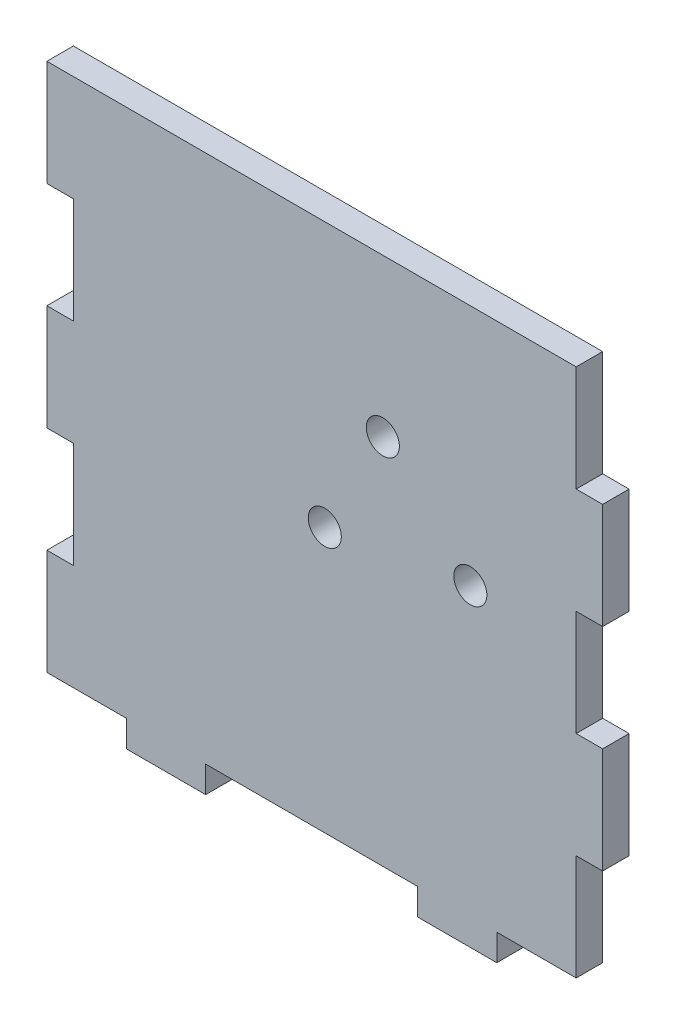
ISO-10303-21;
HEADER;
FILE_DESCRIPTION(('STEP AP214'),'2;1');
FILE_NAME('part.step','',(''),(''),'','','');
FILE_SCHEMA(('AUTOMOTIVE_DESIGN { 1 0 10303 214 1 1 1 1 }'));
ENDSEC;
DATA;
#1=APPLICATION_CONTEXT('core data for automotive mechanical design processes');
#2=APPLICATION_PROTOCOL_DEFINITION('international standard','automotive_design',2000,#1);
#3=PRODUCT_CONTEXT('',#1,'mechanical');
#4=PRODUCT('Part','Part','',(#3));
#5=PRODUCT_RELATED_PRODUCT_CATEGORY('part','',(#4));
#6=PRODUCT_DEFINITION_FORMATION('','',#4);
#7=PRODUCT_DEFINITION_CONTEXT('part definition',#1,'design');
#8=PRODUCT_DEFINITION('design','',#6,#7);
#9=PRODUCT_DEFINITION_SHAPE('','',#8);
#10=(LENGTH_UNIT() NAMED_UNIT(*) SI_UNIT(.MILLI.,.METRE.));
#11=(NAMED_UNIT(*) PLANE_ANGLE_UNIT() SI_UNIT($,.RADIAN.));
#12=(NAMED_UNIT(*) SI_UNIT($,.STERADIAN.) SOLID_ANGLE_UNIT());
#13=UNCERTAINTY_MEASURE_WITH_UNIT(LENGTH_MEASURE(1.E-05),#10,'distance_accuracy_value','');
#14=(GEOMETRIC_REPRESENTATION_CONTEXT(3) GLOBAL_UNCERTAINTY_ASSIGNED_CONTEXT((#13)) GLOBAL_UNIT_ASSIGNED_CONTEXT((#10,
#11,#12)) REPRESENTATION_CONTEXT('',''));
#15=CARTESIAN_POINT('',(0.,0.,0.));
#16=DIRECTION('',(0.,0.,1.));
#17=DIRECTION('',(1.,0.,0.));
#18=AXIS2_PLACEMENT_3D('',#15,#16,#17);
#19=CARTESIAN_POINT('',(-63.5,38.1,6.35));
#20=DIRECTION('',(-1.,0.,0.));
#21=DIRECTION('',(0.,0.,1.));
#22=AXIS2_PLACEMENT_3D('',#19,#20,#21);
#23=PLANE('',#22);
#24=DIRECTION('',(0.,1.,0.));
#25=VECTOR('',#24,1.);
#26=CARTESIAN_POINT('',(-63.5,38.1,0.));
#27=LINE('',#26,#25);
#28=CARTESIAN_POINT('',(-63.5,38.1,0.));
#29=VERTEX_POINT('',#28);
#30=CARTESIAN_POINT('',(-63.5,63.5,0.));
#31=VERTEX_POINT('',#30);
#32=EDGE_CURVE('E252',#29,#31,#27,.T.);
#33=ORIENTED_EDGE('',*,*,#32,.F.);
#34=DIRECTION('',(0.,0.,-1.));
#35=VECTOR('',#34,1.);
#36=CARTESIAN_POINT('',(-63.5,38.1,6.35));
#37=LINE('',#36,#35);
#38=CARTESIAN_POINT('',(-63.5,38.1,6.35));
#39=VERTEX_POINT('',#38);
#40=EDGE_CURVE('E11',#39,#29,#37,.T.);
#41=ORIENTED_EDGE('',*,*,#40,.F.);
#42=DIRECTION('',(0.,1.,0.));
#43=VECTOR('',#42,1.);
#44=CARTESIAN_POINT('',(-63.5,38.1,6.35));
#45=LINE('',#44,#43);
#46=CARTESIAN_POINT('',(-63.5,63.5,6.35));
#47=VERTEX_POINT('',#46);
#48=EDGE_CURVE('E323',#39,#47,#45,.T.);
#49=ORIENTED_EDGE('',*,*,#48,.T.);
#50=DIRECTION('',(0.,0.,-1.));
#51=VECTOR('',#50,1.);
#52=CARTESIAN_POINT('',(-63.5,63.5,6.35));
#53=LINE('',#52,#51);
#54=EDGE_CURVE('E36',#47,#31,#53,.T.);
#55=ORIENTED_EDGE('',*,*,#54,.T.);
#56=EDGE_LOOP('',(#33,#41,#49,#55));
#57=FACE_BOUND('',#56,.T.);
#58=ADVANCED_FACE('F33',(#57),#23,.T.);
#59=CARTESIAN_POINT('',(-63.5,38.1,6.35));
#60=DIRECTION('',(0.,1.,0.));
#61=DIRECTION('',(0.,0.,1.));
#62=AXIS2_PLACEMENT_3D('',#59,#60,#61);
#63=PLANE('',#62);
#64=DIRECTION('',(1.,0.,0.));
#65=VECTOR('',#64,1.);
#66=CARTESIAN_POINT('',(-63.5,38.1,0.));
#67=LINE('',#66,#65);
#68=CARTESIAN_POINT('',(-57.15,38.1,0.));
#69=VERTEX_POINT('',#68);
#70=EDGE_CURVE('E138',#29,#69,#67,.T.);
#71=ORIENTED_EDGE('',*,*,#70,.T.);
#72=DIRECTION('',(0.,0.,-1.));
#73=VECTOR('',#72,1.);
#74=CARTESIAN_POINT('',(-57.15,38.1,6.35));
#75=LINE('',#74,#73);
#76=CARTESIAN_POINT('',(-57.15,38.1,6.35));
#77=VERTEX_POINT('',#76);
#78=EDGE_CURVE('E42',#77,#69,#75,.T.);
#79=ORIENTED_EDGE('',*,*,#78,.F.);
#80=DIRECTION('',(1.,0.,0.));
#81=VECTOR('',#80,1.);
#82=CARTESIAN_POINT('',(-63.5,38.1,6.35));
#83=LINE('',#82,#81);
#84=EDGE_CURVE('E231',#39,#77,#83,.T.);
#85=ORIENTED_EDGE('',*,*,#84,.F.);
#86=ORIENTED_EDGE('',*,*,#40,.T.);
#87=EDGE_LOOP('',(#71,#79,#85,#86));
#88=FACE_BOUND('',#87,.T.);
#89=ADVANCED_FACE('F499',(#88),#63,.F.);
#90=CARTESIAN_POINT('',(-57.15,38.1,6.35));
#91=DIRECTION('',(1.,0.,0.));
#92=DIRECTION('',(0.,1.,0.));
#93=AXIS2_PLACEMENT_3D('',#90,#91,#92);
#94=PLANE('',#93);
#95=DIRECTION('',(0.,-1.,0.));
#96=VECTOR('',#95,1.);
#97=CARTESIAN_POINT('',(-57.15,38.1,0.));
#98=LINE('',#97,#96);
#99=CARTESIAN_POINT('',(-57.15,12.7,0.));
#100=VERTEX_POINT('',#99);
#101=EDGE_CURVE('E238',#69,#100,#98,.T.);
#102=ORIENTED_EDGE('',*,*,#101,.T.);
#103=DIRECTION('',(0.,0.,-1.));
#104=VECTOR('',#103,1.);
#105=CARTESIAN_POINT('',(-57.15,12.7,6.35));
#106=LINE('',#105,#104);
#107=CARTESIAN_POINT('',(-57.15,12.7,6.35));
#108=VERTEX_POINT('',#107);
#109=EDGE_CURVE('E235',#108,#100,#106,.T.);
#110=ORIENTED_EDGE('',*,*,#109,.F.);
#111=DIRECTION('',(0.,-1.,0.));
#112=VECTOR('',#111,1.);
#113=CARTESIAN_POINT('',(-57.15,38.1,6.35));
#114=LINE('',#113,#112);
#115=EDGE_CURVE('E223',#77,#108,#114,.T.);
#116=ORIENTED_EDGE('',*,*,#115,.F.);
#117=ORIENTED_EDGE('',*,*,#78,.T.);
#118=EDGE_LOOP('',(#102,#110,#116,#117));
#119=FACE_BOUND('',#118,.T.);
#120=ADVANCED_FACE('F236',(#119),#94,.F.);
#121=CARTESIAN_POINT('',(-63.5,12.7,6.35));
#122=DIRECTION('',(0.,1.,0.));
#123=DIRECTION('',(-1.,0.,0.));
#124=AXIS2_PLACEMENT_3D('',#121,#122,#123);
#125=PLANE('',#124);
#126=DIRECTION('',(1.,0.,0.));
#127=VECTOR('',#126,1.);
#128=CARTESIAN_POINT('',(-63.5,12.7,0.));
#129=LINE('',#128,#127);
#130=CARTESIAN_POINT('',(-63.5,12.7,0.));
#131=VERTEX_POINT('',#130);
#132=EDGE_CURVE('E320',#131,#100,#129,.T.);
#133=ORIENTED_EDGE('',*,*,#132,.F.);
#134=DIRECTION('',(0.,0.,-1.));
#135=VECTOR('',#134,1.);
#136=CARTESIAN_POINT('',(-63.5,12.7,6.35));
#137=LINE('',#136,#135);
#138=CARTESIAN_POINT('',(-63.5,12.7,6.35));
#139=VERTEX_POINT('',#138);
#140=EDGE_CURVE('E242',#139,#131,#137,.T.);
#141=ORIENTED_EDGE('',*,*,#140,.F.);
#142=DIRECTION('',(1.,0.,0.));
#143=VECTOR('',#142,1.);
#144=CARTESIAN_POINT('',(-63.5,12.7,6.35));
#145=LINE('',#144,#143);
#146=EDGE_CURVE('E229',#139,#108,#145,.T.);
#147=ORIENTED_EDGE('',*,*,#146,.T.);
#148=ORIENTED_EDGE('',*,*,#109,.T.);
#149=EDGE_LOOP('',(#133,#141,#147,#148));
#150=FACE_BOUND('',#149,.T.);
#151=ADVANCED_FACE('F244',(#150),#125,.T.);
#152=CARTESIAN_POINT('',(-63.5,-12.7,6.35));
#153=DIRECTION('',(-1.,0.,0.));
#154=DIRECTION('',(0.,-1.,0.));
#155=AXIS2_PLACEMENT_3D('',#152,#153,#154);
#156=PLANE('',#155);
#157=DIRECTION('',(0.,1.,0.));
#158=VECTOR('',#157,1.);
#159=CARTESIAN_POINT('',(-63.5,-12.7,0.));
#160=LINE('',#159,#158);
#161=CARTESIAN_POINT('',(-63.5,-12.7,0.));
#162=VERTEX_POINT('',#161);
#163=EDGE_CURVE('E317',#162,#131,#160,.T.);
#164=ORIENTED_EDGE('',*,*,#163,.F.);
#165=DIRECTION('',(0.,0.,-1.));
#166=VECTOR('',#165,1.);
#167=CARTESIAN_POINT('',(-63.5,-12.7,6.35));
#168=LINE('',#167,#166);
#169=CARTESIAN_POINT('',(-63.5,-12.7,6.35));
#170=VERTEX_POINT('',#169);
#171=EDGE_CURVE('E327',#170,#162,#168,.T.);
#172=ORIENTED_EDGE('',*,*,#171,.F.);
#173=DIRECTION('',(0.,1.,0.));
#174=VECTOR('',#173,1.);
#175=CARTESIAN_POINT('',(-63.5,-12.7,6.35));
#176=LINE('',#175,#174);
#177=EDGE_CURVE('E245',#170,#139,#176,.T.);
#178=ORIENTED_EDGE('',*,*,#177,.T.);
#179=ORIENTED_EDGE('',*,*,#140,.T.);
#180=EDGE_LOOP('',(#164,#172,#178,#179));
#181=FACE_BOUND('',#180,.T.);
#182=ADVANCED_FACE('F388',(#181),#156,.T.);
#183=CARTESIAN_POINT('',(-63.5,-12.7,6.35));
#184=DIRECTION('',(0.,1.,0.));
#185=DIRECTION('',(0.,0.,1.));
#186=AXIS2_PLACEMENT_3D('',#183,#184,#185);
#187=PLANE('',#186);
#188=DIRECTION('',(1.,0.,0.));
#189=VECTOR('',#188,1.);
#190=CARTESIAN_POINT('',(-63.5,-12.7,0.));
#191=LINE('',#190,#189);
#192=CARTESIAN_POINT('',(-57.15,-12.7,0.));
#193=VERTEX_POINT('',#192);
#194=EDGE_CURVE('E315',#162,#193,#191,.T.);
#195=ORIENTED_EDGE('',*,*,#194,.T.);
#196=DIRECTION('',(0.,0.,-1.));
#197=VECTOR('',#196,1.);
#198=CARTESIAN_POINT('',(-57.15,-12.7,6.35));
#199=LINE('',#198,#197);
#200=CARTESIAN_POINT('',(-57.15,-12.7,6.35));
#201=VERTEX_POINT('',#200);
#202=EDGE_CURVE('E329',#201,#193,#199,.T.);
#203=ORIENTED_EDGE('',*,*,#202,.F.);
#204=DIRECTION('',(1.,0.,0.));
#205=VECTOR('',#204,1.);
#206=CARTESIAN_POINT('',(-63.5,-12.7,6.35));
#207=LINE('',#206,#205);
#208=EDGE_CURVE('E247',#170,#201,#207,.T.);
#209=ORIENTED_EDGE('',*,*,#208,.F.);
#210=ORIENTED_EDGE('',*,*,#171,.T.);
#211=EDGE_LOOP('',(#195,#203,#209,#210));
#212=FACE_BOUND('',#211,.T.);
#213=ADVANCED_FACE('F396',(#212),#187,.F.);
#214=CARTESIAN_POINT('',(-57.15,-12.7,6.35));
#215=DIRECTION('',(1.,0.,0.));
#216=DIRECTION('',(0.,0.,-1.));
#217=AXIS2_PLACEMENT_3D('',#214,#215,#216);
#218=PLANE('',#217);
#219=DIRECTION('',(0.,-1.,0.));
#220=VECTOR('',#219,1.);
#221=CARTESIAN_POINT('',(-57.15,-12.7,0.));
#222=LINE('',#221,#220);
#223=CARTESIAN_POINT('',(-57.15,-38.1,0.));
#224=VERTEX_POINT('',#223);
#225=EDGE_CURVE('E312',#193,#224,#222,.T.);
#226=ORIENTED_EDGE('',*,*,#225,.T.);
#227=DIRECTION('',(0.,0.,-1.));
#228=VECTOR('',#227,1.);
#229=CARTESIAN_POINT('',(-57.15,-38.1,6.35));
#230=LINE('',#229,#228);
#231=CARTESIAN_POINT('',(-57.15,-38.1,6.35));
#232=VERTEX_POINT('',#231);
#233=EDGE_CURVE('E332',#232,#224,#230,.T.);
#234=ORIENTED_EDGE('',*,*,#233,.F.);
#235=DIRECTION('',(0.,-1.,0.));
#236=VECTOR('',#235,1.);
#237=CARTESIAN_POINT('',(-57.15,-12.7,6.35));
#238=LINE('',#237,#236);
#239=EDGE_CURVE('E393',#201,#232,#238,.T.);
#240=ORIENTED_EDGE('',*,*,#239,.F.);
#241=ORIENTED_EDGE('',*,*,#202,.T.);
#242=EDGE_LOOP('',(#226,#234,#240,#241));
#243=FACE_BOUND('',#242,.T.);
#244=ADVANCED_FACE('F398',(#243),#218,.F.);
#245=CARTESIAN_POINT('',(-63.5,-38.1,6.35));
#246=DIRECTION('',(0.,1.,0.));
#247=DIRECTION('',(0.,0.,1.));
#248=AXIS2_PLACEMENT_3D('',#245,#246,#247);
#249=PLANE('',#248);
#250=DIRECTION('',(1.,0.,0.));
#251=VECTOR('',#250,1.);
#252=CARTESIAN_POINT('',(-63.5,-38.1,0.));
#253=LINE('',#252,#251);
#254=CARTESIAN_POINT('',(-63.5,-38.1,0.));
#255=VERTEX_POINT('',#254);
#256=EDGE_CURVE('E309',#255,#224,#253,.T.);
#257=ORIENTED_EDGE('',*,*,#256,.F.);
#258=DIRECTION('',(0.,0.,-1.));
#259=VECTOR('',#258,1.);
#260=CARTESIAN_POINT('',(-63.5,-38.1,6.35));
#261=LINE('',#260,#259);
#262=CARTESIAN_POINT('',(-63.5,-38.1,6.35));
#263=VERTEX_POINT('',#262);
#264=EDGE_CURVE('E334',#263,#255,#261,.T.);
#265=ORIENTED_EDGE('',*,*,#264,.F.);
#266=DIRECTION('',(1.,0.,0.));
#267=VECTOR('',#266,1.);
#268=CARTESIAN_POINT('',(-63.5,-38.1,6.35));
#269=LINE('',#268,#267);
#270=EDGE_CURVE('E400',#263,#232,#269,.T.);
#271=ORIENTED_EDGE('',*,*,#270,.T.);
#272=ORIENTED_EDGE('',*,*,#233,.T.);
#273=EDGE_LOOP('',(#257,#265,#271,#272));
#274=FACE_BOUND('',#273,.T.);
#275=ADVANCED_FACE('F517',(#274),#249,.T.);
#276=CARTESIAN_POINT('',(-63.5,-63.5,6.35));
#277=DIRECTION('',(-1.,0.,0.));
#278=DIRECTION('',(0.,0.,1.));
#279=AXIS2_PLACEMENT_3D('',#276,#277,#278);
#280=PLANE('',#279);
#281=DIRECTION('',(0.,1.,0.));
#282=VECTOR('',#281,1.);
#283=CARTESIAN_POINT('',(-63.5,-63.5,0.));
#284=LINE('',#283,#282);
#285=CARTESIAN_POINT('',(-63.5,-63.5,0.));
#286=VERTEX_POINT('',#285);
#287=EDGE_CURVE('E306',#286,#255,#284,.T.);
#288=ORIENTED_EDGE('',*,*,#287,.F.);
#289=DIRECTION('',(0.,0.,-1.));
#290=VECTOR('',#289,1.);
#291=CARTESIAN_POINT('',(-63.5,-63.5,6.35));
#292=LINE('',#291,#290);
#293=CARTESIAN_POINT('',(-63.5,-63.5,6.35));
#294=VERTEX_POINT('',#293);
#295=EDGE_CURVE('E336',#294,#286,#292,.T.);
#296=ORIENTED_EDGE('',*,*,#295,.F.);
#297=DIRECTION('',(0.,1.,0.));
#298=VECTOR('',#297,1.);
#299=CARTESIAN_POINT('',(-63.5,-63.5,6.35));
#300=LINE('',#299,#298);
#301=EDGE_CURVE('E402',#294,#263,#300,.T.);
#302=ORIENTED_EDGE('',*,*,#301,.T.);
#303=ORIENTED_EDGE('',*,*,#264,.T.);
#304=EDGE_LOOP('',(#288,#296,#302,#303));
#305=FACE_BOUND('',#304,.T.);
#306=ADVANCED_FACE('F520',(#305),#280,.T.);
#307=CARTESIAN_POINT('',(-63.5,-63.5,6.35));
#308=DIRECTION('',(0.,1.,0.));
#309=DIRECTION('',(0.,0.,1.));
#310=AXIS2_PLACEMENT_3D('',#307,#308,#309);
#311=PLANE('',#310);
#312=DIRECTION('',(1.,0.,0.));
#313=VECTOR('',#312,1.);
#314=CARTESIAN_POINT('',(-63.5,-63.5,0.));
#315=LINE('',#314,#313);
#316=CARTESIAN_POINT('',(-44.45,-63.5,0.));
#317=VERTEX_POINT('',#316);
#318=EDGE_CURVE('E304',#286,#317,#315,.T.);
#319=ORIENTED_EDGE('',*,*,#318,.T.);
#320=DIRECTION('',(0.,0.,-1.));
#321=VECTOR('',#320,1.);
#322=CARTESIAN_POINT('',(-44.45,-63.5,6.35));
#323=LINE('',#322,#321);
#324=CARTESIAN_POINT('',(-44.45,-63.5,6.35));
#325=VERTEX_POINT('',#324);
#326=EDGE_CURVE('E338',#325,#317,#323,.T.);
#327=ORIENTED_EDGE('',*,*,#326,.F.);
#328=DIRECTION('',(1.,0.,0.));
#329=VECTOR('',#328,1.);
#330=CARTESIAN_POINT('',(-63.5,-63.5,6.35));
#331=LINE('',#330,#329);
#332=EDGE_CURVE('E407',#294,#325,#331,.T.);
#333=ORIENTED_EDGE('',*,*,#332,.F.);
#334=ORIENTED_EDGE('',*,*,#295,.T.);
#335=EDGE_LOOP('',(#319,#327,#333,#334));
#336=FACE_BOUND('',#335,.T.);
#337=ADVANCED_FACE('F524',(#336),#311,.F.);
#338=CARTESIAN_POINT('',(-44.45,-63.5,6.35));
#339=DIRECTION('',(1.,0.,0.));
#340=DIRECTION('',(0.,0.,-1.));
#341=AXIS2_PLACEMENT_3D('',#338,#339,#340);
#342=PLANE('',#341);
#343=DIRECTION('',(0.,-1.,0.));
#344=VECTOR('',#343,1.);
#345=CARTESIAN_POINT('',(-44.45,-63.5,0.));
#346=LINE('',#345,#344);
#347=CARTESIAN_POINT('',(-44.45,-69.85,0.));
#348=VERTEX_POINT('',#347);
#349=EDGE_CURVE('E302',#317,#348,#346,.T.);
#350=ORIENTED_EDGE('',*,*,#349,.T.);
#351=DIRECTION('',(0.,0.,-1.));
#352=VECTOR('',#351,1.);
#353=CARTESIAN_POINT('',(-44.45,-69.85,6.35));
#354=LINE('',#353,#352);
#355=CARTESIAN_POINT('',(-44.45,-69.85,6.35));
#356=VERTEX_POINT('',#355);
#357=EDGE_CURVE('E341',#356,#348,#354,.T.);
#358=ORIENTED_EDGE('',*,*,#357,.F.);
#359=DIRECTION('',(0.,-1.,0.));
#360=VECTOR('',#359,1.);
#361=CARTESIAN_POINT('',(-44.45,-63.5,6.35));
#362=LINE('',#361,#360);
#363=EDGE_CURVE('E409',#325,#356,#362,.T.);
#364=ORIENTED_EDGE('',*,*,#363,.F.);
#365=ORIENTED_EDGE('',*,*,#326,.T.);
#366=EDGE_LOOP('',(#350,#358,#364,#365));
#367=FACE_BOUND('',#366,.T.);
#368=ADVANCED_FACE('F528',(#367),#342,.F.);
#369=CARTESIAN_POINT('',(-44.45,-69.85,6.35));
#370=DIRECTION('',(0.,1.,0.));
#371=DIRECTION('',(0.,0.,1.));
#372=AXIS2_PLACEMENT_3D('',#369,#370,#371);
#373=PLANE('',#372);
#374=DIRECTION('',(1.,0.,0.));
#375=VECTOR('',#374,1.);
#376=CARTESIAN_POINT('',(-44.45,-69.85,0.));
#377=LINE('',#376,#375);
#378=CARTESIAN_POINT('',(-25.4,-69.85,0.));
#379=VERTEX_POINT('',#378);
#380=EDGE_CURVE('E299',#348,#379,#377,.T.);
#381=ORIENTED_EDGE('',*,*,#380,.T.);
#382=DIRECTION('',(0.,0.,-1.));
#383=VECTOR('',#382,1.);
#384=CARTESIAN_POINT('',(-25.4,-69.85,6.35));
#385=LINE('',#384,#383);
#386=CARTESIAN_POINT('',(-25.4,-69.85,6.35));
#387=VERTEX_POINT('',#386);
#388=EDGE_CURVE('E344',#387,#379,#385,.T.);
#389=ORIENTED_EDGE('',*,*,#388,.F.);
#390=DIRECTION('',(1.,0.,0.));
#391=VECTOR('',#390,1.);
#392=CARTESIAN_POINT('',(-44.45,-69.85,6.35));
#393=LINE('',#392,#391);
#394=EDGE_CURVE('E411',#356,#387,#393,.T.);
#395=ORIENTED_EDGE('',*,*,#394,.F.);
#396=ORIENTED_EDGE('',*,*,#357,.T.);
#397=EDGE_LOOP('',(#381,#389,#395,#396));
#398=FACE_BOUND('',#397,.T.);
#399=ADVANCED_FACE('F532',(#398),#373,.F.);
#400=CARTESIAN_POINT('',(-25.4,-63.5,6.35));
#401=DIRECTION('',(1.,0.,0.));
#402=DIRECTION('',(0.,1.,0.));
#403=AXIS2_PLACEMENT_3D('',#400,#401,#402);
#404=PLANE('',#403);
#405=DIRECTION('',(0.,-1.,0.));
#406=VECTOR('',#405,1.);
#407=CARTESIAN_POINT('',(-25.4,-63.5,0.));
#408=LINE('',#407,#406);
#409=CARTESIAN_POINT('',(-25.4,-63.5,0.));
#410=VERTEX_POINT('',#409);
#411=EDGE_CURVE('E296',#410,#379,#408,.T.);
#412=ORIENTED_EDGE('',*,*,#411,.F.);
#413=DIRECTION('',(0.,0.,-1.));
#414=VECTOR('',#413,1.);
#415=CARTESIAN_POINT('',(-25.4,-63.5,6.35));
#416=LINE('',#415,#414);
#417=CARTESIAN_POINT('',(-25.4,-63.5,6.35));
#418=VERTEX_POINT('',#417);
#419=EDGE_CURVE('E346',#418,#410,#416,.T.);
#420=ORIENTED_EDGE('',*,*,#419,.F.);
#421=DIRECTION('',(0.,-1.,0.));
#422=VECTOR('',#421,1.);
#423=CARTESIAN_POINT('',(-25.4,-63.5,6.35));
#424=LINE('',#423,#422);
#425=EDGE_CURVE('E413',#418,#387,#424,.T.);
#426=ORIENTED_EDGE('',*,*,#425,.T.);
#427=ORIENTED_EDGE('',*,*,#388,.T.);
#428=EDGE_LOOP('',(#412,#420,#426,#427));
#429=FACE_BOUND('',#428,.T.);
#430=ADVANCED_FACE('F536',(#429),#404,.T.);
#431=CARTESIAN_POINT('',(-25.4,-63.5,6.35));
#432=DIRECTION('',(0.,1.,0.));
#433=DIRECTION('',(0.,0.,1.));
#434=AXIS2_PLACEMENT_3D('',#431,#432,#433);
#435=PLANE('',#434);
#436=DIRECTION('',(1.,0.,0.));
#437=VECTOR('',#436,1.);
#438=CARTESIAN_POINT('',(-25.4,-63.5,0.));
#439=LINE('',#438,#437);
#440=CARTESIAN_POINT('',(25.4,-63.5,0.));
#441=VERTEX_POINT('',#440);
#442=EDGE_CURVE('E294',#410,#441,#439,.T.);
#443=ORIENTED_EDGE('',*,*,#442,.T.);
#444=DIRECTION('',(0.,0.,-1.));
#445=VECTOR('',#444,1.);
#446=CARTESIAN_POINT('',(25.4,-63.5,6.35));
#447=LINE('',#446,#445);
#448=CARTESIAN_POINT('',(25.4,-63.5,6.35));
#449=VERTEX_POINT('',#448);
#450=EDGE_CURVE('E348',#449,#441,#447,.T.);
#451=ORIENTED_EDGE('',*,*,#450,.F.);
#452=DIRECTION('',(1.,0.,0.));
#453=VECTOR('',#452,1.);
#454=CARTESIAN_POINT('',(-25.4,-63.5,6.35));
#455=LINE('',#454,#453);
#456=EDGE_CURVE('E416',#418,#449,#455,.T.);
#457=ORIENTED_EDGE('',*,*,#456,.F.);
#458=ORIENTED_EDGE('',*,*,#419,.T.);
#459=EDGE_LOOP('',(#443,#451,#457,#458));
#460=FACE_BOUND('',#459,.T.);
#461=ADVANCED_FACE('F540',(#460),#435,.F.);
#462=CARTESIAN_POINT('',(25.4,-63.5,6.35));
#463=DIRECTION('',(1.,0.,0.));
#464=DIRECTION('',(0.,1.,0.));
#465=AXIS2_PLACEMENT_3D('',#462,#463,#464);
#466=PLANE('',#465);
#467=DIRECTION('',(0.,-1.,0.));
#468=VECTOR('',#467,1.);
#469=CARTESIAN_POINT('',(25.4,-63.5,0.));
#470=LINE('',#469,#468);
#471=CARTESIAN_POINT('',(25.4,-69.85,0.));
#472=VERTEX_POINT('',#471);
#473=EDGE_CURVE('E292',#441,#472,#470,.T.);
#474=ORIENTED_EDGE('',*,*,#473,.T.);
#475=DIRECTION('',(0.,0.,-1.));
#476=VECTOR('',#475,1.);
#477=CARTESIAN_POINT('',(25.4,-69.85,6.35));
#478=LINE('',#477,#476);
#479=CARTESIAN_POINT('',(25.4,-69.85,6.35));
#480=VERTEX_POINT('',#479);
#481=EDGE_CURVE('E351',#480,#472,#478,.T.);
#482=ORIENTED_EDGE('',*,*,#481,.F.);
#483=DIRECTION('',(0.,-1.,0.));
#484=VECTOR('',#483,1.);
#485=CARTESIAN_POINT('',(25.4,-63.5,6.35));
#486=LINE('',#485,#484);
#487=EDGE_CURVE('E418',#449,#480,#486,.T.);
#488=ORIENTED_EDGE('',*,*,#487,.F.);
#489=ORIENTED_EDGE('',*,*,#450,.T.);
#490=EDGE_LOOP('',(#474,#482,#488,#489));
#491=FACE_BOUND('',#490,.T.);
#492=ADVANCED_FACE('F544',(#491),#466,.F.);
#493=CARTESIAN_POINT('',(25.4,-69.85,6.35));
#494=DIRECTION('',(0.,1.,0.));
#495=DIRECTION('',(0.,0.,1.));
#496=AXIS2_PLACEMENT_3D('',#493,#494,#495);
#497=PLANE('',#496);
#498=DIRECTION('',(1.,0.,0.));
#499=VECTOR('',#498,1.);
#500=CARTESIAN_POINT('',(25.4,-69.85,0.));
#501=LINE('',#500,#499);
#502=CARTESIAN_POINT('',(44.45,-69.85,0.));
#503=VERTEX_POINT('',#502);
#504=EDGE_CURVE('E289',#472,#503,#501,.T.);
#505=ORIENTED_EDGE('',*,*,#504,.T.);
#506=DIRECTION('',(0.,0.,-1.));
#507=VECTOR('',#506,1.);
#508=CARTESIAN_POINT('',(44.45,-69.85,6.35));
#509=LINE('',#508,#507);
#510=CARTESIAN_POINT('',(44.45,-69.85,6.35));
#511=VERTEX_POINT('',#510);
#512=EDGE_CURVE('E354',#511,#503,#509,.T.);
#513=ORIENTED_EDGE('',*,*,#512,.F.);
#514=DIRECTION('',(1.,0.,0.));
#515=VECTOR('',#514,1.);
#516=CARTESIAN_POINT('',(25.4,-69.85,6.35));
#517=LINE('',#516,#515);
#518=EDGE_CURVE('E420',#480,#511,#517,.T.);
#519=ORIENTED_EDGE('',*,*,#518,.F.);
#520=ORIENTED_EDGE('',*,*,#481,.T.);
#521=EDGE_LOOP('',(#505,#513,#519,#520));
#522=FACE_BOUND('',#521,.T.);
#523=ADVANCED_FACE('F548',(#522),#497,.F.);
#524=CARTESIAN_POINT('',(44.45,-63.5,6.35));
#525=DIRECTION('',(1.,0.,0.));
#526=DIRECTION('',(0.,0.,-1.));
#527=AXIS2_PLACEMENT_3D('',#524,#525,#526);
#528=PLANE('',#527);
#529=DIRECTION('',(0.,-1.,0.));
#530=VECTOR('',#529,1.);
#531=CARTESIAN_POINT('',(44.45,-63.5,0.));
#532=LINE('',#531,#530);
#533=CARTESIAN_POINT('',(44.45,-63.5,0.));
#534=VERTEX_POINT('',#533);
#535=EDGE_CURVE('E286',#534,#503,#532,.T.);
#536=ORIENTED_EDGE('',*,*,#535,.F.);
#537=DIRECTION('',(0.,0.,-1.));
#538=VECTOR('',#537,1.);
#539=CARTESIAN_POINT('',(44.45,-63.5,6.35));
#540=LINE('',#539,#538);
#541=CARTESIAN_POINT('',(44.45,-63.5,6.35));
#542=VERTEX_POINT('',#541);
#543=EDGE_CURVE('E356',#542,#534,#540,.T.);
#544=ORIENTED_EDGE('',*,*,#543,.F.);
#545=DIRECTION('',(0.,-1.,0.));
#546=VECTOR('',#545,1.);
#547=CARTESIAN_POINT('',(44.45,-63.5,6.35));
#548=LINE('',#547,#546);
#549=EDGE_CURVE('E422',#542,#511,#548,.T.);
#550=ORIENTED_EDGE('',*,*,#549,.T.);
#551=ORIENTED_EDGE('',*,*,#512,.T.);
#552=EDGE_LOOP('',(#536,#544,#550,#551));
#553=FACE_BOUND('',#552,.T.);
#554=ADVANCED_FACE('F552',(#553),#528,.T.);
#555=CARTESIAN_POINT('',(44.45,-63.5,6.35));
#556=DIRECTION('',(0.,1.,0.));
#557=DIRECTION('',(0.,0.,1.));
#558=AXIS2_PLACEMENT_3D('',#555,#556,#557);
#559=PLANE('',#558);
#560=DIRECTION('',(1.,0.,0.));
#561=VECTOR('',#560,1.);
#562=CARTESIAN_POINT('',(44.45,-63.5,0.));
#563=LINE('',#562,#561);
#564=CARTESIAN_POINT('',(63.5,-63.5,0.));
#565=VERTEX_POINT('',#564);
#566=EDGE_CURVE('E284',#534,#565,#563,.T.);
#567=ORIENTED_EDGE('',*,*,#566,.T.);
#568=DIRECTION('',(0.,0.,-1.));
#569=VECTOR('',#568,1.);
#570=CARTESIAN_POINT('',(63.5,-63.5,6.35));
#571=LINE('',#570,#569);
#572=CARTESIAN_POINT('',(63.5,-63.5,6.35));
#573=VERTEX_POINT('',#572);
#574=EDGE_CURVE('E358',#573,#565,#571,.T.);
#575=ORIENTED_EDGE('',*,*,#574,.F.);
#576=DIRECTION('',(1.,0.,0.));
#577=VECTOR('',#576,1.);
#578=CARTESIAN_POINT('',(44.45,-63.5,6.35));
#579=LINE('',#578,#577);
#580=EDGE_CURVE('E425',#542,#573,#579,.T.);
#581=ORIENTED_EDGE('',*,*,#580,.F.);
#582=ORIENTED_EDGE('',*,*,#543,.T.);
#583=EDGE_LOOP('',(#567,#575,#581,#582));
#584=FACE_BOUND('',#583,.T.);
#585=ADVANCED_FACE('F556',(#584),#559,.F.);
#586=CARTESIAN_POINT('',(63.5,-63.5,6.35));
#587=DIRECTION('',(-1.,0.,0.));
#588=DIRECTION('',(0.,0.,1.));
#589=AXIS2_PLACEMENT_3D('',#586,#587,#588);
#590=PLANE('',#589);
#591=DIRECTION('',(0.,1.,0.));
#592=VECTOR('',#591,1.);
#593=CARTESIAN_POINT('',(63.5,-63.5,0.));
#594=LINE('',#593,#592);
#595=CARTESIAN_POINT('',(63.5,-38.1,0.));
#596=VERTEX_POINT('',#595);
#597=EDGE_CURVE('E282',#565,#596,#594,.T.);
#598=ORIENTED_EDGE('',*,*,#597,.T.);
#599=DIRECTION('',(0.,0.,-1.));
#600=VECTOR('',#599,1.);
#601=CARTESIAN_POINT('',(63.5,-38.1,6.35));
#602=LINE('',#601,#600);
#603=CARTESIAN_POINT('',(63.5,-38.1,6.35));
#604=VERTEX_POINT('',#603);
#605=EDGE_CURVE('E361',#604,#596,#602,.T.);
#606=ORIENTED_EDGE('',*,*,#605,.F.);
#607=DIRECTION('',(0.,1.,0.));
#608=VECTOR('',#607,1.);
#609=CARTESIAN_POINT('',(63.5,-63.5,6.35));
#610=LINE('',#609,#608);
#611=EDGE_CURVE('E427',#573,#604,#610,.T.);
#612=ORIENTED_EDGE('',*,*,#611,.F.);
#613=ORIENTED_EDGE('',*,*,#574,.T.);
#614=EDGE_LOOP('',(#598,#606,#612,#613));
#615=FACE_BOUND('',#614,.T.);
#616=ADVANCED_FACE('F560',(#615),#590,.F.);
#617=CARTESIAN_POINT('',(63.5,-38.1,6.35));
#618=DIRECTION('',(0.,1.,0.));
#619=DIRECTION('',(-1.,0.,0.));
#620=AXIS2_PLACEMENT_3D('',#617,#618,#619);
#621=PLANE('',#620);
#622=DIRECTION('',(1.,0.,0.));
#623=VECTOR('',#622,1.);
#624=CARTESIAN_POINT('',(63.5,-38.1,0.));
#625=LINE('',#624,#623);
#626=CARTESIAN_POINT('',(69.8500000000001,-38.1,0.));
#627=VERTEX_POINT('',#626);
#628=EDGE_CURVE('E279',#596,#627,#625,.T.);
#629=ORIENTED_EDGE('',*,*,#628,.T.);
#630=DIRECTION('',(0.,0.,-1.));
#631=VECTOR('',#630,1.);
#632=CARTESIAN_POINT('',(69.8500000000001,-38.1,6.35));
#633=LINE('',#632,#631);
#634=CARTESIAN_POINT('',(69.8500000000001,-38.1,6.35));
#635=VERTEX_POINT('',#634);
#636=EDGE_CURVE('E364',#635,#627,#633,.T.);
#637=ORIENTED_EDGE('',*,*,#636,.F.);
#638=DIRECTION('',(1.,0.,0.));
#639=VECTOR('',#638,1.);
#640=CARTESIAN_POINT('',(63.5,-38.1,6.35));
#641=LINE('',#640,#639);
#642=EDGE_CURVE('E429',#604,#635,#641,.T.);
#643=ORIENTED_EDGE('',*,*,#642,.F.);
#644=ORIENTED_EDGE('',*,*,#605,.T.);
#645=EDGE_LOOP('',(#629,#637,#643,#644));
#646=FACE_BOUND('',#645,.T.);
#647=ADVANCED_FACE('F564',(#646),#621,.F.);
#648=CARTESIAN_POINT('',(69.85,-12.7,6.35));
#649=DIRECTION('',(1.,0.,0.));
#650=DIRECTION('',(0.,1.,0.));
#651=AXIS2_PLACEMENT_3D('',#648,#649,#650);
#652=PLANE('',#651);
#653=DIRECTION('',(0.,-1.,0.));
#654=VECTOR('',#653,1.);
#655=CARTESIAN_POINT('',(69.85,-12.7,0.));
#656=LINE('',#655,#654);
#657=CARTESIAN_POINT('',(69.85,-12.7,0.));
#658=VERTEX_POINT('',#657);
#659=EDGE_CURVE('E276',#658,#627,#656,.T.);
#660=ORIENTED_EDGE('',*,*,#659,.F.);
#661=DIRECTION('',(0.,0.,-1.));
#662=VECTOR('',#661,1.);
#663=CARTESIAN_POINT('',(69.85,-12.7,6.35));
#664=LINE('',#663,#662);
#665=CARTESIAN_POINT('',(69.85,-12.7,6.35));
#666=VERTEX_POINT('',#665);
#667=EDGE_CURVE('E366',#666,#658,#664,.T.);
#668=ORIENTED_EDGE('',*,*,#667,.F.);
#669=DIRECTION('',(0.,-1.,0.));
#670=VECTOR('',#669,1.);
#671=CARTESIAN_POINT('',(69.85,-12.7,6.35));
#672=LINE('',#671,#670);
#673=EDGE_CURVE('E431',#666,#635,#672,.T.);
#674=ORIENTED_EDGE('',*,*,#673,.T.);
#675=ORIENTED_EDGE('',*,*,#636,.T.);
#676=EDGE_LOOP('',(#660,#668,#674,#675));
#677=FACE_BOUND('',#676,.T.);
#678=ADVANCED_FACE('F568',(#677),#652,.T.);
#679=CARTESIAN_POINT('',(63.5,-12.7,6.35));
#680=DIRECTION('',(0.,1.,0.));
#681=DIRECTION('',(0.,0.,1.));
#682=AXIS2_PLACEMENT_3D('',#679,#680,#681);
#683=PLANE('',#682);
#684=DIRECTION('',(1.,0.,0.));
#685=VECTOR('',#684,1.);
#686=CARTESIAN_POINT('',(63.5,-12.7,0.));
#687=LINE('',#686,#685);
#688=CARTESIAN_POINT('',(63.5,-12.7,0.));
#689=VERTEX_POINT('',#688);
#690=EDGE_CURVE('E273',#689,#658,#687,.T.);
#691=ORIENTED_EDGE('',*,*,#690,.F.);
#692=DIRECTION('',(0.,0.,-1.));
#693=VECTOR('',#692,1.);
#694=CARTESIAN_POINT('',(63.5,-12.7,6.35));
#695=LINE('',#694,#693);
#696=CARTESIAN_POINT('',(63.5,-12.7,6.35));
#697=VERTEX_POINT('',#696);
#698=EDGE_CURVE('E368',#697,#689,#695,.T.);
#699=ORIENTED_EDGE('',*,*,#698,.F.);
#700=DIRECTION('',(1.,0.,0.));
#701=VECTOR('',#700,1.);
#702=CARTESIAN_POINT('',(63.5,-12.7,6.35));
#703=LINE('',#702,#701);
#704=EDGE_CURVE('E434',#697,#666,#703,.T.);
#705=ORIENTED_EDGE('',*,*,#704,.T.);
#706=ORIENTED_EDGE('',*,*,#667,.T.);
#707=EDGE_LOOP('',(#691,#699,#705,#706));
#708=FACE_BOUND('',#707,.T.);
#709=ADVANCED_FACE('F572',(#708),#683,.T.);
#710=CARTESIAN_POINT('',(63.5,-12.7,6.35));
#711=DIRECTION('',(-1.,0.,0.));
#712=DIRECTION('',(0.,0.,1.));
#713=AXIS2_PLACEMENT_3D('',#710,#711,#712);
#714=PLANE('',#713);
#715=DIRECTION('',(0.,1.,0.));
#716=VECTOR('',#715,1.);
#717=CARTESIAN_POINT('',(63.5,-12.7,0.));
#718=LINE('',#717,#716);
#719=CARTESIAN_POINT('',(63.5,12.7,0.));
#720=VERTEX_POINT('',#719);
#721=EDGE_CURVE('E271',#689,#720,#718,.T.);
#722=ORIENTED_EDGE('',*,*,#721,.T.);
#723=DIRECTION('',(0.,0.,-1.));
#724=VECTOR('',#723,1.);
#725=CARTESIAN_POINT('',(63.5,12.7,6.35));
#726=LINE('',#725,#724);
#727=CARTESIAN_POINT('',(63.5,12.7,6.35));
#728=VERTEX_POINT('',#727);
#729=EDGE_CURVE('E370',#728,#720,#726,.T.);
#730=ORIENTED_EDGE('',*,*,#729,.F.);
#731=DIRECTION('',(0.,1.,0.));
#732=VECTOR('',#731,1.);
#733=CARTESIAN_POINT('',(63.5,-12.7,6.35));
#734=LINE('',#733,#732);
#735=EDGE_CURVE('E437',#697,#728,#734,.T.);
#736=ORIENTED_EDGE('',*,*,#735,.F.);
#737=ORIENTED_EDGE('',*,*,#698,.T.);
#738=EDGE_LOOP('',(#722,#730,#736,#737));
#739=FACE_BOUND('',#738,.T.);
#740=ADVANCED_FACE('F576',(#739),#714,.F.);
#741=CARTESIAN_POINT('',(63.5,12.7,6.35));
#742=DIRECTION('',(0.,1.,0.));
#743=DIRECTION('',(0.,0.,1.));
#744=AXIS2_PLACEMENT_3D('',#741,#742,#743);
#745=PLANE('',#744);
#746=DIRECTION('',(1.,0.,0.));
#747=VECTOR('',#746,1.);
#748=CARTESIAN_POINT('',(63.5,12.7,0.));
#749=LINE('',#748,#747);
#750=CARTESIAN_POINT('',(69.85,12.7,0.));
#751=VERTEX_POINT('',#750);
#752=EDGE_CURVE('E268',#720,#751,#749,.T.);
#753=ORIENTED_EDGE('',*,*,#752,.T.);
#754=DIRECTION('',(0.,0.,-1.));
#755=VECTOR('',#754,1.);
#756=CARTESIAN_POINT('',(69.85,12.7,6.35));
#757=LINE('',#756,#755);
#758=CARTESIAN_POINT('',(69.85,12.7,6.35));
#759=VERTEX_POINT('',#758);
#760=EDGE_CURVE('E373',#759,#751,#757,.T.);
#761=ORIENTED_EDGE('',*,*,#760,.F.);
#762=DIRECTION('',(1.,0.,0.));
#763=VECTOR('',#762,1.);
#764=CARTESIAN_POINT('',(63.5,12.7,6.35));
#765=LINE('',#764,#763);
#766=EDGE_CURVE('E439',#728,#759,#765,.T.);
#767=ORIENTED_EDGE('',*,*,#766,.F.);
#768=ORIENTED_EDGE('',*,*,#729,.T.);
#769=EDGE_LOOP('',(#753,#761,#767,#768));
#770=FACE_BOUND('',#769,.T.);
#771=ADVANCED_FACE('F580',(#770),#745,.F.);
#772=CARTESIAN_POINT('',(69.85,38.1,6.35));
#773=DIRECTION('',(1.,0.,0.));
#774=DIRECTION('',(0.,0.,-1.));
#775=AXIS2_PLACEMENT_3D('',#772,#773,#774);
#776=PLANE('',#775);
#777=DIRECTION('',(0.,-1.,0.));
#778=VECTOR('',#777,1.);
#779=CARTESIAN_POINT('',(69.85,38.1,0.));
#780=LINE('',#779,#778);
#781=CARTESIAN_POINT('',(69.85,38.1,0.));
#782=VERTEX_POINT('',#781);
#783=EDGE_CURVE('E265',#782,#751,#780,.T.);
#784=ORIENTED_EDGE('',*,*,#783,.F.);
#785=DIRECTION('',(0.,0.,-1.));
#786=VECTOR('',#785,1.);
#787=CARTESIAN_POINT('',(69.85,38.1,6.35));
#788=LINE('',#787,#786);
#789=CARTESIAN_POINT('',(69.85,38.1,6.35));
#790=VERTEX_POINT('',#789);
#791=EDGE_CURVE('E375',#790,#782,#788,.T.);
#792=ORIENTED_EDGE('',*,*,#791,.F.);
#793=DIRECTION('',(0.,-1.,0.));
#794=VECTOR('',#793,1.);
#795=CARTESIAN_POINT('',(69.85,38.1,6.35));
#796=LINE('',#795,#794);
#797=EDGE_CURVE('E441',#790,#759,#796,.T.);
#798=ORIENTED_EDGE('',*,*,#797,.T.);
#799=ORIENTED_EDGE('',*,*,#760,.T.);
#800=EDGE_LOOP('',(#784,#792,#798,#799));
#801=FACE_BOUND('',#800,.T.);
#802=ADVANCED_FACE('F584',(#801),#776,.T.);
#803=CARTESIAN_POINT('',(63.5,38.1,6.35));
#804=DIRECTION('',(0.,1.,0.));
#805=DIRECTION('',(-1.,0.,0.));
#806=AXIS2_PLACEMENT_3D('',#803,#804,#805);
#807=PLANE('',#806);
#808=DIRECTION('',(1.,0.,0.));
#809=VECTOR('',#808,1.);
#810=CARTESIAN_POINT('',(63.5,38.1,0.));
#811=LINE('',#810,#809);
#812=CARTESIAN_POINT('',(63.5,38.1,0.));
#813=VERTEX_POINT('',#812);
#814=EDGE_CURVE('E262',#813,#782,#811,.T.);
#815=ORIENTED_EDGE('',*,*,#814,.F.);
#816=DIRECTION('',(0.,0.,-1.));
#817=VECTOR('',#816,1.);
#818=CARTESIAN_POINT('',(63.5,38.1,6.35));
#819=LINE('',#818,#817);
#820=CARTESIAN_POINT('',(63.5,38.1,6.35));
#821=VERTEX_POINT('',#820);
#822=EDGE_CURVE('E377',#821,#813,#819,.T.);
#823=ORIENTED_EDGE('',*,*,#822,.F.);
#824=DIRECTION('',(1.,0.,0.));
#825=VECTOR('',#824,1.);
#826=CARTESIAN_POINT('',(63.5,38.1,6.35));
#827=LINE('',#826,#825);
#828=EDGE_CURVE('E444',#821,#790,#827,.T.);
#829=ORIENTED_EDGE('',*,*,#828,.T.);
#830=ORIENTED_EDGE('',*,*,#791,.T.);
#831=EDGE_LOOP('',(#815,#823,#829,#830));
#832=FACE_BOUND('',#831,.T.);
#833=ADVANCED_FACE('F588',(#832),#807,.T.);
#834=CARTESIAN_POINT('',(63.5,38.1,6.35));
#835=DIRECTION('',(-1.,0.,0.));
#836=DIRECTION('',(0.,0.,1.));
#837=AXIS2_PLACEMENT_3D('',#834,#835,#836);
#838=PLANE('',#837);
#839=DIRECTION('',(0.,1.,0.));
#840=VECTOR('',#839,1.);
#841=CARTESIAN_POINT('',(63.5,38.1,0.));
#842=LINE('',#841,#840);
#843=CARTESIAN_POINT('',(63.5,63.5,0.));
#844=VERTEX_POINT('',#843);
#845=EDGE_CURVE('E259',#813,#844,#842,.T.);
#846=ORIENTED_EDGE('',*,*,#845,.T.);
#847=DIRECTION('',(0.,0.,-1.));
#848=VECTOR('',#847,1.);
#849=CARTESIAN_POINT('',(63.5,63.5,6.35));
#850=LINE('',#849,#848);
#851=CARTESIAN_POINT('',(63.5,63.5,6.35));
#852=VERTEX_POINT('',#851);
#853=EDGE_CURVE('E378',#852,#844,#850,.T.);
#854=ORIENTED_EDGE('',*,*,#853,.F.);
#855=DIRECTION('',(0.,1.,0.));
#856=VECTOR('',#855,1.);
#857=CARTESIAN_POINT('',(63.5,38.1,6.35));
#858=LINE('',#857,#856);
#859=EDGE_CURVE('E447',#821,#852,#858,.T.);
#860=ORIENTED_EDGE('',*,*,#859,.F.);
#861=ORIENTED_EDGE('',*,*,#822,.T.);
#862=EDGE_LOOP('',(#846,#854,#860,#861));
#863=FACE_BOUND('',#862,.T.);
#864=ADVANCED_FACE('F592',(#863),#838,.F.);
#865=CARTESIAN_POINT('',(-63.5,63.5,6.35));
#866=DIRECTION('',(0.,1.,0.));
#867=DIRECTION('',(0.,0.,1.));
#868=AXIS2_PLACEMENT_3D('',#865,#866,#867);
#869=PLANE('',#868);
#870=DIRECTION('',(1.,0.,0.));
#871=VECTOR('',#870,1.);
#872=CARTESIAN_POINT('',(-63.5,63.5,0.));
#873=LINE('',#872,#871);
#874=EDGE_CURVE('E255',#31,#844,#873,.T.);
#875=ORIENTED_EDGE('',*,*,#874,.F.);
#876=ORIENTED_EDGE('',*,*,#54,.F.);
#877=DIRECTION('',(1.,0.,0.));
#878=VECTOR('',#877,1.);
#879=CARTESIAN_POINT('',(-63.5,63.5,6.35));
#880=LINE('',#879,#878);
#881=EDGE_CURVE('E449',#47,#852,#880,.T.);
#882=ORIENTED_EDGE('',*,*,#881,.T.);
#883=ORIENTED_EDGE('',*,*,#853,.T.);
#884=EDGE_LOOP('',(#875,#876,#882,#883));
#885=FACE_BOUND('',#884,.T.);
#886=ADVANCED_FACE('F380',(#885),#869,.T.);
#887=CARTESIAN_POINT('',(0.,0.,6.35));
#888=DIRECTION('',(0.,0.,-1.));
#889=DIRECTION('',(-1.,0.,0.));
#890=AXIS2_PLACEMENT_3D('',#887,#888,#889);
#891=PLANE('',#890);
#892=CARTESIAN_POINT('',(17.1052508833751,25.7754466796645,6.35));
#893=DIRECTION('',(0.,0.,1.));
#894=DIRECTION('',(1.,0.,0.));
#895=AXIS2_PLACEMENT_3D('',#892,#893,#894);
#896=CIRCLE('',#895,3.96875000000001);
#897=CARTESIAN_POINT('',(21.0740008833751,25.7754466796645,6.35));
#898=VERTEX_POINT('',#897);
#899=EDGE_CURVE('E464',#898,#898,#896,.T.);
#900=ORIENTED_EDGE('',*,*,#899,.F.);
#901=EDGE_LOOP('',(#900));
#902=FACE_BOUND('',#901,.T.);
#903=CARTESIAN_POINT('',(38.1,5.33905632471252,6.35));
#904=DIRECTION('',(0.,0.,1.));
#905=DIRECTION('',(1.,0.,0.));
#906=AXIS2_PLACEMENT_3D('',#903,#904,#905);
#907=CIRCLE('',#906,3.96874999999999);
#908=CARTESIAN_POINT('',(42.06875,5.33905632471252,6.35));
#909=VERTEX_POINT('',#908);
#910=EDGE_CURVE('E458',#909,#909,#907,.T.);
#911=ORIENTED_EDGE('',*,*,#910,.F.);
#912=EDGE_LOOP('',(#911));
#913=FACE_BOUND('',#912,.T.);
#914=CARTESIAN_POINT('',(3.17500000000001,0.,6.35));
#915=DIRECTION('',(0.,0.,1.));
#916=DIRECTION('',(1.,0.,0.));
#917=AXIS2_PLACEMENT_3D('',#914,#915,#916);
#918=CIRCLE('',#917,3.96875);
#919=CARTESIAN_POINT('',(7.14375000000001,0.,6.35));
#920=VERTEX_POINT('',#919);
#921=EDGE_CURVE('E452',#920,#920,#918,.T.);
#922=ORIENTED_EDGE('',*,*,#921,.F.);
#923=EDGE_LOOP('',(#922));
#924=FACE_BOUND('',#923,.T.);
#925=ORIENTED_EDGE('',*,*,#48,.F.);
#926=ORIENTED_EDGE('',*,*,#84,.T.);
#927=ORIENTED_EDGE('',*,*,#115,.T.);
#928=ORIENTED_EDGE('',*,*,#146,.F.);
#929=ORIENTED_EDGE('',*,*,#177,.F.);
#930=ORIENTED_EDGE('',*,*,#208,.T.);
#931=ORIENTED_EDGE('',*,*,#239,.T.);
#932=ORIENTED_EDGE('',*,*,#270,.F.);
#933=ORIENTED_EDGE('',*,*,#301,.F.);
#934=ORIENTED_EDGE('',*,*,#332,.T.);
#935=ORIENTED_EDGE('',*,*,#363,.T.);
#936=ORIENTED_EDGE('',*,*,#394,.T.);
#937=ORIENTED_EDGE('',*,*,#425,.F.);
#938=ORIENTED_EDGE('',*,*,#456,.T.);
#939=ORIENTED_EDGE('',*,*,#487,.T.);
#940=ORIENTED_EDGE('',*,*,#518,.T.);
#941=ORIENTED_EDGE('',*,*,#549,.F.);
#942=ORIENTED_EDGE('',*,*,#580,.T.);
#943=ORIENTED_EDGE('',*,*,#611,.T.);
#944=ORIENTED_EDGE('',*,*,#642,.T.);
#945=ORIENTED_EDGE('',*,*,#673,.F.);
#946=ORIENTED_EDGE('',*,*,#704,.F.);
#947=ORIENTED_EDGE('',*,*,#735,.T.);
#948=ORIENTED_EDGE('',*,*,#766,.T.);
#949=ORIENTED_EDGE('',*,*,#797,.F.);
#950=ORIENTED_EDGE('',*,*,#828,.F.);
#951=ORIENTED_EDGE('',*,*,#859,.T.);
#952=ORIENTED_EDGE('',*,*,#881,.F.);
#953=EDGE_LOOP('',(#925,#926,#927,#928,#929,#930,#931,#932,#933,#934,#935,#936,#937,#938,#939,
#940,#941,#942,#943,#944,#945,#946,#947,#948,#949,#950,#951,#952));
#954=FACE_BOUND('',#953,.T.);
#955=ADVANCED_FACE('F226',(#902,#913,#924,#954),#891,.F.);
#956=CARTESIAN_POINT('',(0.,0.,0.));
#957=DIRECTION('',(0.,0.,-1.));
#958=DIRECTION('',(-1.,0.,0.));
#959=AXIS2_PLACEMENT_3D('',#956,#957,#958);
#960=PLANE('',#959);
#961=CARTESIAN_POINT('',(17.1052508833751,25.7754466796645,0.));
#962=DIRECTION('',(0.,0.,1.));
#963=DIRECTION('',(1.,0.,0.));
#964=AXIS2_PLACEMENT_3D('',#961,#962,#963);
#965=CIRCLE('',#964,3.96875000000001);
#966=CARTESIAN_POINT('',(21.0740008833751,25.7754466796645,0.));
#967=VERTEX_POINT('',#966);
#968=EDGE_CURVE('E461',#967,#967,#965,.T.);
#969=ORIENTED_EDGE('',*,*,#968,.T.);
#970=EDGE_LOOP('',(#969));
#971=FACE_BOUND('',#970,.T.);
#972=CARTESIAN_POINT('',(38.1,5.33905632471252,0.));
#973=DIRECTION('',(0.,0.,1.));
#974=DIRECTION('',(1.,0.,0.));
#975=AXIS2_PLACEMENT_3D('',#972,#973,#974);
#976=CIRCLE('',#975,3.96874999999999);
#977=CARTESIAN_POINT('',(42.06875,5.33905632471252,0.));
#978=VERTEX_POINT('',#977);
#979=EDGE_CURVE('E455',#978,#978,#976,.T.);
#980=ORIENTED_EDGE('',*,*,#979,.T.);
#981=EDGE_LOOP('',(#980));
#982=FACE_BOUND('',#981,.T.);
#983=CARTESIAN_POINT('',(3.17500000000001,0.,0.));
#984=DIRECTION('',(0.,0.,1.));
#985=DIRECTION('',(1.,0.,0.));
#986=AXIS2_PLACEMENT_3D('',#983,#984,#985);
#987=CIRCLE('',#986,3.96875);
#988=CARTESIAN_POINT('',(7.14375000000001,0.,0.));
#989=VERTEX_POINT('',#988);
#990=EDGE_CURVE('E256',#989,#989,#987,.T.);
#991=ORIENTED_EDGE('',*,*,#990,.T.);
#992=EDGE_LOOP('',(#991));
#993=FACE_BOUND('',#992,.T.);
#994=ORIENTED_EDGE('',*,*,#32,.T.);
#995=ORIENTED_EDGE('',*,*,#874,.T.);
#996=ORIENTED_EDGE('',*,*,#845,.F.);
#997=ORIENTED_EDGE('',*,*,#814,.T.);
#998=ORIENTED_EDGE('',*,*,#783,.T.);
#999=ORIENTED_EDGE('',*,*,#752,.F.);
#1000=ORIENTED_EDGE('',*,*,#721,.F.);
#1001=ORIENTED_EDGE('',*,*,#690,.T.);
#1002=ORIENTED_EDGE('',*,*,#659,.T.);
#1003=ORIENTED_EDGE('',*,*,#628,.F.);
#1004=ORIENTED_EDGE('',*,*,#597,.F.);
#1005=ORIENTED_EDGE('',*,*,#566,.F.);
#1006=ORIENTED_EDGE('',*,*,#535,.T.);
#1007=ORIENTED_EDGE('',*,*,#504,.F.);
#1008=ORIENTED_EDGE('',*,*,#473,.F.);
#1009=ORIENTED_EDGE('',*,*,#442,.F.);
#1010=ORIENTED_EDGE('',*,*,#411,.T.);
#1011=ORIENTED_EDGE('',*,*,#380,.F.);
#1012=ORIENTED_EDGE('',*,*,#349,.F.);
#1013=ORIENTED_EDGE('',*,*,#318,.F.);
#1014=ORIENTED_EDGE('',*,*,#287,.T.);
#1015=ORIENTED_EDGE('',*,*,#256,.T.);
#1016=ORIENTED_EDGE('',*,*,#225,.F.);
#1017=ORIENTED_EDGE('',*,*,#194,.F.);
#1018=ORIENTED_EDGE('',*,*,#163,.T.);
#1019=ORIENTED_EDGE('',*,*,#132,.T.);
#1020=ORIENTED_EDGE('',*,*,#101,.F.);
#1021=ORIENTED_EDGE('',*,*,#70,.F.);
#1022=EDGE_LOOP('',(#994,#995,#996,#997,#998,#999,#1000,#1001,#1002,#1003,#1004,#1005,#1006,
#1007,#1008,#1009,#1010,#1011,#1012,#1013,#1014,#1015,#1016,#1017,#1018,#1019,#1020,#1021));
#1023=FACE_BOUND('',#1022,.T.);
#1024=ADVANCED_FACE('F383',(#971,#982,#993,#1023),#960,.T.);
#1025=CARTESIAN_POINT('',(3.17500000000001,0.,0.));
#1026=DIRECTION('',(0.,0.,1.));
#1027=DIRECTION('',(1.,0.,0.));
#1028=AXIS2_PLACEMENT_3D('',#1025,#1026,#1027);
#1029=CYLINDRICAL_SURFACE('',#1028,3.96875);
#1030=ORIENTED_EDGE('',*,*,#990,.F.);
#1031=EDGE_LOOP('',(#1030));
#1032=FACE_BOUND('',#1031,.T.);
#1033=ORIENTED_EDGE('',*,*,#921,.T.);
#1034=EDGE_LOOP('',(#1033));
#1035=FACE_BOUND('',#1034,.T.);
#1036=ADVANCED_FACE('F486',(#1032,#1035),#1029,.F.);
#1037=CARTESIAN_POINT('',(38.1,5.33905632471252,0.));
#1038=DIRECTION('',(0.,0.,1.));
#1039=DIRECTION('',(1.,0.,0.));
#1040=AXIS2_PLACEMENT_3D('',#1037,#1038,#1039);
#1041=CYLINDRICAL_SURFACE('',#1040,3.96874999999999);
#1042=ORIENTED_EDGE('',*,*,#979,.F.);
#1043=EDGE_LOOP('',(#1042));
#1044=FACE_BOUND('',#1043,.T.);
#1045=ORIENTED_EDGE('',*,*,#910,.T.);
#1046=EDGE_LOOP('',(#1045));
#1047=FACE_BOUND('',#1046,.T.);
#1048=ADVANCED_FACE('F475',(#1044,#1047),#1041,.F.);
#1049=CARTESIAN_POINT('',(17.1052508833751,25.7754466796645,0.));
#1050=DIRECTION('',(0.,0.,1.));
#1051=DIRECTION('',(1.,0.,0.));
#1052=AXIS2_PLACEMENT_3D('',#1049,#1050,#1051);
#1053=CYLINDRICAL_SURFACE('',#1052,3.96875000000001);
#1054=ORIENTED_EDGE('',*,*,#968,.F.);
#1055=EDGE_LOOP('',(#1054));
#1056=FACE_BOUND('',#1055,.T.);
#1057=ORIENTED_EDGE('',*,*,#899,.T.);
#1058=EDGE_LOOP('',(#1057));
#1059=FACE_BOUND('',#1058,.T.);
#1060=ADVANCED_FACE('F472',(#1056,#1059),#1053,.F.);
#1061=CLOSED_SHELL('',(#58,#89,#120,#151,#182,#213,#244,#275,#306,#337,#368,#399,#430,#461,#492,
#523,#554,#585,#616,#647,#678,#709,#740,#771,#802,#833,#864,#886,#955,#1024,#1036,#1048,#1060));
#1062=MANIFOLD_SOLID_BREP('B2',#1061);
#1063=ADVANCED_BREP_SHAPE_REPRESENTATION('',(#18,#1062),#14);
#1064=SHAPE_DEFINITION_REPRESENTATION(#9,#1063);
ENDSEC;
END-ISO-10303-21;
